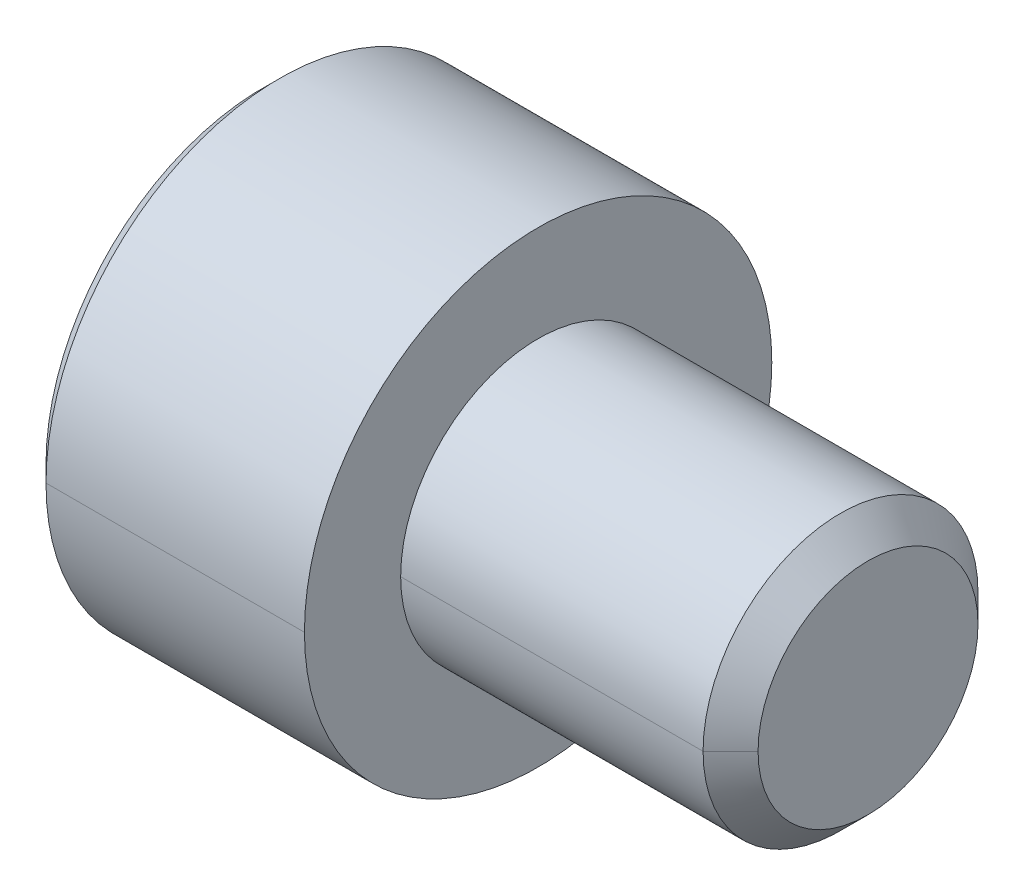
ISO-10303-21;
HEADER;
FILE_DESCRIPTION(('STEP AP214'),'2;1');
FILE_NAME('part.step','',(''),(''),'','','');
FILE_SCHEMA(('AUTOMOTIVE_DESIGN { 1 0 10303 214 1 1 1 1 }'));
ENDSEC;
DATA;
#1=APPLICATION_CONTEXT('core data for automotive mechanical design processes');
#2=APPLICATION_PROTOCOL_DEFINITION('international standard','automotive_design',2000,#1);
#3=PRODUCT_CONTEXT('',#1,'mechanical');
#4=PRODUCT('Part','Part','',(#3));
#5=PRODUCT_RELATED_PRODUCT_CATEGORY('part','',(#4));
#6=PRODUCT_DEFINITION_FORMATION('','',#4);
#7=PRODUCT_DEFINITION_CONTEXT('part definition',#1,'design');
#8=PRODUCT_DEFINITION('design','',#6,#7);
#9=PRODUCT_DEFINITION_SHAPE('','',#8);
#10=(LENGTH_UNIT() NAMED_UNIT(*) SI_UNIT(.MILLI.,.METRE.));
#11=(NAMED_UNIT(*) PLANE_ANGLE_UNIT() SI_UNIT($,.RADIAN.));
#12=(NAMED_UNIT(*) SI_UNIT($,.STERADIAN.) SOLID_ANGLE_UNIT());
#13=UNCERTAINTY_MEASURE_WITH_UNIT(LENGTH_MEASURE(1.E-05),#10,'distance_accuracy_value','');
#14=(GEOMETRIC_REPRESENTATION_CONTEXT(3) GLOBAL_UNCERTAINTY_ASSIGNED_CONTEXT((#13)) GLOBAL_UNIT_ASSIGNED_CONTEXT((#10,
#11,#12)) REPRESENTATION_CONTEXT('',''));
#15=CARTESIAN_POINT('',(0.,0.,0.));
#16=DIRECTION('',(0.,0.,1.));
#17=DIRECTION('',(1.,0.,0.));
#18=AXIS2_PLACEMENT_3D('',#15,#16,#17);
#19=CARTESIAN_POINT('',(-6.,2.59807621135332,1.5));
#20=DIRECTION('',(0.894427190999916,-0.387298334620742,-0.223606797749979));
#21=DIRECTION('',(0.,0.5,-0.866025403784439));
#22=AXIS2_PLACEMENT_3D('',#19,#20,#21);
#23=PLANE('',#22);
#24=DIRECTION('',(0.397359707119513,0.458831467741124,0.794719414239026));
#25=VECTOR('',#24,1.);
#26=CARTESIAN_POINT('',(-8.5,-1.15470053837925,-2.));
#27=LINE('',#26,#25);
#28=CARTESIAN_POINT('',(-8.5,-1.15470053837925,-2.));
#29=VERTEX_POINT('',#28);
#30=CARTESIAN_POINT('',(-7.5,0.,0.));
#31=VERTEX_POINT('',#30);
#32=EDGE_CURVE('E278',#29,#31,#27,.T.);
#33=ORIENTED_EDGE('',*,*,#32,.F.);
#34=CARTESIAN_POINT('',(-8.5,-1.15470053837925,-2.));
#35=CARTESIAN_POINT('',(-8.5,-1.53960071783901,-1.33333333333333));
#36=CARTESIAN_POINT('',(-8.5,-1.92450089729875,-0.666666666666667));
#37=CARTESIAN_POINT('',(-8.5,-2.30940107675851,0.));
#38=(BOUNDED_CURVE() B_SPLINE_CURVE(3,(#34,#35,#36,#37),.UNSPECIFIED.,.F.,
.F.) B_SPLINE_CURVE_WITH_KNOTS((4,4),(0.,1.),
.UNSPECIFIED.) CURVE() GEOMETRIC_REPRESENTATION_ITEM() RATIONAL_B_SPLINE_CURVE((1.,1.,1.,1.)) REPRESENTATION_ITEM(''));
#39=CARTESIAN_POINT('',(-8.5,-2.30940107675851,0.));
#40=VERTEX_POINT('',#39);
#41=EDGE_CURVE('E241',#29,#40,#38,.T.);
#42=ORIENTED_EDGE('',*,*,#41,.T.);
#43=DIRECTION('',(0.397359707119513,0.917662935482247,0.));
#44=VECTOR('',#43,1.);
#45=CARTESIAN_POINT('',(-8.5,-2.30940107675851,0.));
#46=LINE('',#45,#44);
#47=EDGE_CURVE('E10',#40,#31,#46,.T.);
#48=ORIENTED_EDGE('',*,*,#47,.T.);
#49=EDGE_LOOP('',(#33,#42,#48));
#50=FACE_BOUND('',#49,.T.);
#51=ADVANCED_FACE('F16',(#50),#23,.F.);
#52=CARTESIAN_POINT('',(-6.,2.59807621135332,-1.5));
#53=DIRECTION('',(0.894427190999916,-0.387298334620742,0.223606797749978));
#54=DIRECTION('',(0.,-0.5,-0.866025403784439));
#55=AXIS2_PLACEMENT_3D('',#52,#53,#54);
#56=PLANE('',#55);
#57=ORIENTED_EDGE('',*,*,#47,.F.);
#58=CARTESIAN_POINT('',(-8.5,-2.30940107675851,0.));
#59=CARTESIAN_POINT('',(-8.5,-1.92450089729875,0.666666666666667));
#60=CARTESIAN_POINT('',(-8.5,-1.53960071783901,1.33333333333333));
#61=CARTESIAN_POINT('',(-8.5,-1.15470053837925,2.));
#62=(BOUNDED_CURVE() B_SPLINE_CURVE(3,(#58,#59,#60,#61),.UNSPECIFIED.,.F.,
.F.) B_SPLINE_CURVE_WITH_KNOTS((4,4),(0.,1.),
.UNSPECIFIED.) CURVE() GEOMETRIC_REPRESENTATION_ITEM() RATIONAL_B_SPLINE_CURVE((1.,1.,1.,1.)) REPRESENTATION_ITEM(''));
#63=CARTESIAN_POINT('',(-8.5,-1.15470053837925,2.));
#64=VERTEX_POINT('',#63);
#65=EDGE_CURVE('E232',#40,#64,#62,.T.);
#66=ORIENTED_EDGE('',*,*,#65,.T.);
#67=DIRECTION('',(0.397359707119513,0.458831467741124,-0.794719414239026));
#68=VECTOR('',#67,1.);
#69=CARTESIAN_POINT('',(-8.5,-1.15470053837925,2.));
#70=LINE('',#69,#68);
#71=EDGE_CURVE('E27',#64,#31,#70,.T.);
#72=ORIENTED_EDGE('',*,*,#71,.T.);
#73=EDGE_LOOP('',(#57,#66,#72));
#74=FACE_BOUND('',#73,.T.);
#75=ADVANCED_FACE('F365',(#74),#56,.F.);
#76=CARTESIAN_POINT('',(-6.,0.,-3.));
#77=DIRECTION('',(0.894427190999916,0.,0.447213595499958));
#78=DIRECTION('',(0.,-1.,0.));
#79=AXIS2_PLACEMENT_3D('',#76,#77,#78);
#80=PLANE('',#79);
#81=ORIENTED_EDGE('',*,*,#71,.F.);
#82=CARTESIAN_POINT('',(-8.5,-1.15470053837925,2.));
#83=CARTESIAN_POINT('',(-8.5,-0.384900179459752,2.));
#84=CARTESIAN_POINT('',(-8.5,0.38490017945975,2.));
#85=CARTESIAN_POINT('',(-8.5,1.15470053837925,2.));
#86=(BOUNDED_CURVE() B_SPLINE_CURVE(3,(#82,#83,#84,#85),.UNSPECIFIED.,.F.,
.F.) B_SPLINE_CURVE_WITH_KNOTS((4,4),(0.,1.),
.UNSPECIFIED.) CURVE() GEOMETRIC_REPRESENTATION_ITEM() RATIONAL_B_SPLINE_CURVE((1.,1.,1.,1.)) REPRESENTATION_ITEM(''));
#87=CARTESIAN_POINT('',(-8.5,1.15470053837925,2.));
#88=VERTEX_POINT('',#87);
#89=EDGE_CURVE('E216',#64,#88,#86,.T.);
#90=ORIENTED_EDGE('',*,*,#89,.T.);
#91=DIRECTION('',(0.397359707119513,-0.458831467741124,-0.794719414239026));
#92=VECTOR('',#91,1.);
#93=CARTESIAN_POINT('',(-8.5,1.15470053837925,2.));
#94=LINE('',#93,#92);
#95=EDGE_CURVE('E282',#88,#31,#94,.T.);
#96=ORIENTED_EDGE('',*,*,#95,.T.);
#97=EDGE_LOOP('',(#81,#90,#96));
#98=FACE_BOUND('',#97,.T.);
#99=ADVANCED_FACE('F366',(#98),#80,.F.);
#100=CARTESIAN_POINT('',(-6.,-2.59807621135332,-1.5));
#101=DIRECTION('',(0.894427190999916,0.387298334620742,0.223606797749979));
#102=DIRECTION('',(0.,0.5,-0.866025403784439));
#103=AXIS2_PLACEMENT_3D('',#100,#101,#102);
#104=PLANE('',#103);
#105=ORIENTED_EDGE('',*,*,#95,.F.);
#106=CARTESIAN_POINT('',(-8.5,1.15470053837925,2.));
#107=CARTESIAN_POINT('',(-8.5,1.539600717839,1.33333333333333));
#108=CARTESIAN_POINT('',(-8.5,1.92450089729875,0.666666666666667));
#109=CARTESIAN_POINT('',(-8.5,2.30940107675851,0.));
#110=(BOUNDED_CURVE() B_SPLINE_CURVE(3,(#106,#107,#108,#109),.UNSPECIFIED.,.F.,
.F.) B_SPLINE_CURVE_WITH_KNOTS((4,4),(0.,1.),
.UNSPECIFIED.) CURVE() GEOMETRIC_REPRESENTATION_ITEM() RATIONAL_B_SPLINE_CURVE((1.,1.,1.,1.)) REPRESENTATION_ITEM(''));
#111=CARTESIAN_POINT('',(-8.5,2.30940107675851,0.));
#112=VERTEX_POINT('',#111);
#113=EDGE_CURVE('E217',#88,#112,#110,.T.);
#114=ORIENTED_EDGE('',*,*,#113,.T.);
#115=DIRECTION('',(0.397359707119513,-0.917662935482247,0.));
#116=VECTOR('',#115,1.);
#117=CARTESIAN_POINT('',(-8.5,2.30940107675851,0.));
#118=LINE('',#117,#116);
#119=EDGE_CURVE('E218',#112,#31,#118,.T.);
#120=ORIENTED_EDGE('',*,*,#119,.T.);
#121=EDGE_LOOP('',(#105,#114,#120));
#122=FACE_BOUND('',#121,.T.);
#123=ADVANCED_FACE('F378',(#122),#104,.F.);
#124=CARTESIAN_POINT('',(-6.,0.,3.));
#125=DIRECTION('',(0.894427190999916,0.,-0.447213595499958));
#126=DIRECTION('',(0.,-1.,0.));
#127=AXIS2_PLACEMENT_3D('',#124,#125,#126);
#128=PLANE('',#127);
#129=DIRECTION('',(0.397359707119513,-0.458831467741124,0.794719414239026));
#130=VECTOR('',#129,1.);
#131=CARTESIAN_POINT('',(-8.5,1.15470053837925,-2.));
#132=LINE('',#131,#130);
#133=CARTESIAN_POINT('',(-8.5,1.15470053837925,-2.));
#134=VERTEX_POINT('',#133);
#135=EDGE_CURVE('E221',#134,#31,#132,.T.);
#136=ORIENTED_EDGE('',*,*,#135,.F.);
#137=CARTESIAN_POINT('',(-8.5,1.15470053837925,-2.));
#138=CARTESIAN_POINT('',(-8.5,0.384900179459751,-2.));
#139=CARTESIAN_POINT('',(-8.5,-0.384900179459751,-2.));
#140=CARTESIAN_POINT('',(-8.5,-1.15470053837925,-2.));
#141=(BOUNDED_CURVE() B_SPLINE_CURVE(3,(#137,#138,#139,#140),.UNSPECIFIED.,.F.,
.F.) B_SPLINE_CURVE_WITH_KNOTS((4,4),(0.,1.),
.UNSPECIFIED.) CURVE() GEOMETRIC_REPRESENTATION_ITEM() RATIONAL_B_SPLINE_CURVE((1.,1.,1.,1.)) REPRESENTATION_ITEM(''));
#142=EDGE_CURVE('E321',#134,#29,#141,.T.);
#143=ORIENTED_EDGE('',*,*,#142,.T.);
#144=ORIENTED_EDGE('',*,*,#32,.T.);
#145=EDGE_LOOP('',(#136,#143,#144));
#146=FACE_BOUND('',#145,.T.);
#147=ADVANCED_FACE('F18',(#146),#128,.F.);
#148=CARTESIAN_POINT('',(-6.,-2.59807621135332,1.5));
#149=DIRECTION('',(0.894427190999916,0.387298334620742,-0.223606797749979));
#150=DIRECTION('',(0.,-0.5,-0.866025403784439));
#151=AXIS2_PLACEMENT_3D('',#148,#149,#150);
#152=PLANE('',#151);
#153=ORIENTED_EDGE('',*,*,#119,.F.);
#154=CARTESIAN_POINT('',(-8.5,2.30940107675851,0.));
#155=CARTESIAN_POINT('',(-8.5,1.92450089729875,-0.666666666666667));
#156=CARTESIAN_POINT('',(-8.5,1.53960071783901,-1.33333333333333));
#157=CARTESIAN_POINT('',(-8.5,1.15470053837925,-2.));
#158=(BOUNDED_CURVE() B_SPLINE_CURVE(3,(#154,#155,#156,#157),.UNSPECIFIED.,.F.,
.F.) B_SPLINE_CURVE_WITH_KNOTS((4,4),(0.,1.),
.UNSPECIFIED.) CURVE() GEOMETRIC_REPRESENTATION_ITEM() RATIONAL_B_SPLINE_CURVE((1.,1.,1.,1.)) REPRESENTATION_ITEM(''));
#159=EDGE_CURVE('E222',#112,#134,#158,.T.);
#160=ORIENTED_EDGE('',*,*,#159,.T.);
#161=ORIENTED_EDGE('',*,*,#135,.T.);
#162=EDGE_LOOP('',(#153,#160,#161));
#163=FACE_BOUND('',#162,.T.);
#164=ADVANCED_FACE('F382',(#163),#152,.F.);
#165=CARTESIAN_POINT('',(-11.,0.,0.));
#166=DIRECTION('',(1.,0.,0.));
#167=DIRECTION('',(0.,0.,-1.));
#168=AXIS2_PLACEMENT_3D('',#165,#166,#167);
#169=CONICAL_SURFACE('',#168,3.95,0.785398163397446);
#170=DIRECTION('',(0.70710678118655,0.,0.707106781186546));
#171=VECTOR('',#170,1.);
#172=CARTESIAN_POINT('',(-11.,0.,3.95));
#173=LINE('',#172,#171);
#174=CARTESIAN_POINT('',(-11.,0.,3.95));
#175=VERTEX_POINT('',#174);
#176=CARTESIAN_POINT('',(-10.7,0.,4.25));
#177=VERTEX_POINT('',#176);
#178=EDGE_CURVE('E194',#175,#177,#173,.T.);
#179=ORIENTED_EDGE('',*,*,#178,.F.);
#180=CARTESIAN_POINT('',(-11.,0.,0.));
#181=DIRECTION('',(-1.,0.,0.));
#182=DIRECTION('',(0.,0.,-1.));
#183=AXIS2_PLACEMENT_3D('',#180,#181,#182);
#184=CIRCLE('',#183,3.95);
#185=CARTESIAN_POINT('',(-11.,0.,-3.95));
#186=VERTEX_POINT('',#185);
#187=EDGE_CURVE('E307',#186,#175,#184,.T.);
#188=ORIENTED_EDGE('',*,*,#187,.F.);
#189=DIRECTION('',(0.70710678118655,0.,-0.707106781186546));
#190=VECTOR('',#189,1.);
#191=CARTESIAN_POINT('',(-11.,0.,-3.95));
#192=LINE('',#191,#190);
#193=CARTESIAN_POINT('',(-10.7,0.,-4.25));
#194=VERTEX_POINT('',#193);
#195=EDGE_CURVE('E189',#186,#194,#192,.T.);
#196=ORIENTED_EDGE('',*,*,#195,.T.);
#197=CARTESIAN_POINT('',(-10.7,0.,0.));
#198=DIRECTION('',(1.,0.,0.));
#199=DIRECTION('',(0.,0.,-1.));
#200=AXIS2_PLACEMENT_3D('',#197,#198,#199);
#201=CIRCLE('',#200,4.25);
#202=EDGE_CURVE('E239',#177,#194,#201,.T.);
#203=ORIENTED_EDGE('',*,*,#202,.F.);
#204=EDGE_LOOP('',(#179,#188,#196,#203));
#205=FACE_BOUND('',#204,.T.);
#206=ADVANCED_FACE('F414',(#205),#169,.T.);
#207=CARTESIAN_POINT('',(-8.5,2.30940107675851,0.));
#208=DIRECTION('',(0.,0.866025403784439,-0.5));
#209=DIRECTION('',(-1.,0.,0.));
#210=AXIS2_PLACEMENT_3D('',#207,#208,#209);
#211=PLANE('',#210);
#212=DIRECTION('',(0.,-0.5,-0.866025403784439));
#213=VECTOR('',#212,1.);
#214=CARTESIAN_POINT('',(-11.,2.30940107675851,0.));
#215=LINE('',#214,#213);
#216=CARTESIAN_POINT('',(-11.,2.30940107675851,0.));
#217=VERTEX_POINT('',#216);
#218=CARTESIAN_POINT('',(-11.,1.15470053837925,-2.));
#219=VERTEX_POINT('',#218);
#220=EDGE_CURVE('E228',#217,#219,#215,.T.);
#221=ORIENTED_EDGE('',*,*,#220,.T.);
#222=DIRECTION('',(-1.,0.,0.));
#223=VECTOR('',#222,1.);
#224=CARTESIAN_POINT('',(-8.5,1.15470053837925,-2.));
#225=LINE('',#224,#223);
#226=EDGE_CURVE('E267',#134,#219,#225,.T.);
#227=ORIENTED_EDGE('',*,*,#226,.F.);
#228=ORIENTED_EDGE('',*,*,#159,.F.);
#229=DIRECTION('',(-1.,0.,0.));
#230=VECTOR('',#229,1.);
#231=CARTESIAN_POINT('',(-8.5,2.30940107675851,0.));
#232=LINE('',#231,#230);
#233=EDGE_CURVE('E288',#112,#217,#232,.T.);
#234=ORIENTED_EDGE('',*,*,#233,.T.);
#235=EDGE_LOOP('',(#221,#227,#228,#234));
#236=FACE_BOUND('',#235,.T.);
#237=ADVANCED_FACE('F384',(#236),#211,.F.);
#238=CARTESIAN_POINT('',(-8.5,1.15470053837925,-2.));
#239=DIRECTION('',(0.,0.,-1.));
#240=DIRECTION('',(0.,-1.,0.));
#241=AXIS2_PLACEMENT_3D('',#238,#239,#240);
#242=PLANE('',#241);
#243=DIRECTION('',(0.,-1.,0.));
#244=VECTOR('',#243,1.);
#245=CARTESIAN_POINT('',(-11.,1.15470053837925,-2.));
#246=LINE('',#245,#244);
#247=CARTESIAN_POINT('',(-11.,-1.15470053837925,-2.));
#248=VERTEX_POINT('',#247);
#249=EDGE_CURVE('E291',#219,#248,#246,.T.);
#250=ORIENTED_EDGE('',*,*,#249,.T.);
#251=DIRECTION('',(-1.,0.,0.));
#252=VECTOR('',#251,1.);
#253=CARTESIAN_POINT('',(-8.5,-1.15470053837925,-2.));
#254=LINE('',#253,#252);
#255=EDGE_CURVE('E111',#29,#248,#254,.T.);
#256=ORIENTED_EDGE('',*,*,#255,.F.);
#257=ORIENTED_EDGE('',*,*,#142,.F.);
#258=ORIENTED_EDGE('',*,*,#226,.T.);
#259=EDGE_LOOP('',(#250,#256,#257,#258));
#260=FACE_BOUND('',#259,.T.);
#261=ADVANCED_FACE('F386',(#260),#242,.F.);
#262=CARTESIAN_POINT('',(-8.5,-1.15470053837925,-2.));
#263=DIRECTION('',(0.,-0.866025403784439,-0.5));
#264=DIRECTION('',(0.,0.5,-0.866025403784439));
#265=AXIS2_PLACEMENT_3D('',#262,#263,#264);
#266=PLANE('',#265);
#267=DIRECTION('',(0.,-0.5,0.866025403784439));
#268=VECTOR('',#267,1.);
#269=CARTESIAN_POINT('',(-11.,-1.15470053837925,-2.));
#270=LINE('',#269,#268);
#271=CARTESIAN_POINT('',(-11.,-2.30940107675851,0.));
#272=VERTEX_POINT('',#271);
#273=EDGE_CURVE('E207',#248,#272,#270,.T.);
#274=ORIENTED_EDGE('',*,*,#273,.T.);
#275=DIRECTION('',(-1.,0.,0.));
#276=VECTOR('',#275,1.);
#277=CARTESIAN_POINT('',(-8.5,-2.30940107675851,0.));
#278=LINE('',#277,#276);
#279=EDGE_CURVE('E99',#40,#272,#278,.T.);
#280=ORIENTED_EDGE('',*,*,#279,.F.);
#281=ORIENTED_EDGE('',*,*,#41,.F.);
#282=ORIENTED_EDGE('',*,*,#255,.T.);
#283=EDGE_LOOP('',(#274,#280,#281,#282));
#284=FACE_BOUND('',#283,.T.);
#285=ADVANCED_FACE('F387',(#284),#266,.F.);
#286=CARTESIAN_POINT('',(-8.5,-2.30940107675851,0.));
#287=DIRECTION('',(0.,-0.866025403784439,0.5));
#288=DIRECTION('',(-1.,0.,0.));
#289=AXIS2_PLACEMENT_3D('',#286,#287,#288);
#290=PLANE('',#289);
#291=DIRECTION('',(0.,0.5,0.866025403784439));
#292=VECTOR('',#291,1.);
#293=CARTESIAN_POINT('',(-11.,-2.30940107675851,0.));
#294=LINE('',#293,#292);
#295=CARTESIAN_POINT('',(-11.,-1.15470053837925,2.));
#296=VERTEX_POINT('',#295);
#297=EDGE_CURVE('E204',#272,#296,#294,.T.);
#298=ORIENTED_EDGE('',*,*,#297,.T.);
#299=DIRECTION('',(-1.,0.,0.));
#300=VECTOR('',#299,1.);
#301=CARTESIAN_POINT('',(-8.5,-1.15470053837925,2.));
#302=LINE('',#301,#300);
#303=EDGE_CURVE('E229',#64,#296,#302,.T.);
#304=ORIENTED_EDGE('',*,*,#303,.F.);
#305=ORIENTED_EDGE('',*,*,#65,.F.);
#306=ORIENTED_EDGE('',*,*,#279,.T.);
#307=EDGE_LOOP('',(#298,#304,#305,#306));
#308=FACE_BOUND('',#307,.T.);
#309=ADVANCED_FACE('F444',(#308),#290,.F.);
#310=CARTESIAN_POINT('',(-8.5,-1.15470053837925,2.));
#311=DIRECTION('',(0.,0.,1.));
#312=DIRECTION('',(0.,-1.,0.));
#313=AXIS2_PLACEMENT_3D('',#310,#311,#312);
#314=PLANE('',#313);
#315=DIRECTION('',(0.,1.,0.));
#316=VECTOR('',#315,1.);
#317=CARTESIAN_POINT('',(-11.,-1.15470053837925,2.));
#318=LINE('',#317,#316);
#319=CARTESIAN_POINT('',(-11.,1.15470053837925,2.));
#320=VERTEX_POINT('',#319);
#321=EDGE_CURVE('E208',#296,#320,#318,.T.);
#322=ORIENTED_EDGE('',*,*,#321,.T.);
#323=DIRECTION('',(-1.,0.,0.));
#324=VECTOR('',#323,1.);
#325=CARTESIAN_POINT('',(-8.5,1.15470053837925,2.));
#326=LINE('',#325,#324);
#327=EDGE_CURVE('E212',#88,#320,#326,.T.);
#328=ORIENTED_EDGE('',*,*,#327,.F.);
#329=ORIENTED_EDGE('',*,*,#89,.F.);
#330=ORIENTED_EDGE('',*,*,#303,.T.);
#331=EDGE_LOOP('',(#322,#328,#329,#330));
#332=FACE_BOUND('',#331,.T.);
#333=ADVANCED_FACE('F371',(#332),#314,.F.);
#334=CARTESIAN_POINT('',(-8.5,1.15470053837925,2.));
#335=DIRECTION('',(0.,0.866025403784439,0.5));
#336=DIRECTION('',(1.,0.,0.));
#337=AXIS2_PLACEMENT_3D('',#334,#335,#336);
#338=PLANE('',#337);
#339=DIRECTION('',(0.,0.5,-0.866025403784439));
#340=VECTOR('',#339,1.);
#341=CARTESIAN_POINT('',(-11.,1.15470053837925,2.));
#342=LINE('',#341,#340);
#343=EDGE_CURVE('E224',#320,#217,#342,.T.);
#344=ORIENTED_EDGE('',*,*,#343,.T.);
#345=ORIENTED_EDGE('',*,*,#233,.F.);
#346=ORIENTED_EDGE('',*,*,#113,.F.);
#347=ORIENTED_EDGE('',*,*,#327,.T.);
#348=EDGE_LOOP('',(#344,#345,#346,#347));
#349=FACE_BOUND('',#348,.T.);
#350=ADVANCED_FACE('F376',(#349),#338,.F.);
#351=CARTESIAN_POINT('',(-0.5,0.,0.));
#352=DIRECTION('',(-1.,0.,0.));
#353=DIRECTION('',(0.,0.,1.));
#354=AXIS2_PLACEMENT_3D('',#351,#352,#353);
#355=CONICAL_SURFACE('',#354,2.5,0.78539816339745);
#356=DIRECTION('',(-0.707106781186546,0.,-0.707106781186549));
#357=VECTOR('',#356,1.);
#358=CARTESIAN_POINT('',(-0.5,0.,-2.5));
#359=LINE('',#358,#357);
#360=CARTESIAN_POINT('',(0.,0.,-2.));
#361=VERTEX_POINT('',#360);
#362=CARTESIAN_POINT('',(-0.5,0.,-2.5));
#363=VERTEX_POINT('',#362);
#364=EDGE_CURVE('E152',#361,#363,#359,.T.);
#365=ORIENTED_EDGE('',*,*,#364,.F.);
#366=CARTESIAN_POINT('',(0.,0.,0.));
#367=DIRECTION('',(1.,0.,0.));
#368=DIRECTION('',(0.,0.,1.));
#369=AXIS2_PLACEMENT_3D('',#366,#367,#368);
#370=CIRCLE('',#369,2.);
#371=CARTESIAN_POINT('',(0.,0.,2.));
#372=VERTEX_POINT('',#371);
#373=EDGE_CURVE('E142',#372,#361,#370,.T.);
#374=ORIENTED_EDGE('',*,*,#373,.F.);
#375=DIRECTION('',(-0.707106781186546,0.,0.707106781186549));
#376=VECTOR('',#375,1.);
#377=CARTESIAN_POINT('',(-0.5,0.,2.5));
#378=LINE('',#377,#376);
#379=CARTESIAN_POINT('',(-0.5,0.,2.5));
#380=VERTEX_POINT('',#379);
#381=EDGE_CURVE('E154',#372,#380,#378,.T.);
#382=ORIENTED_EDGE('',*,*,#381,.T.);
#383=CARTESIAN_POINT('',(-0.5,0.,0.));
#384=DIRECTION('',(-1.,0.,0.));
#385=DIRECTION('',(0.,0.,1.));
#386=AXIS2_PLACEMENT_3D('',#383,#384,#385);
#387=CIRCLE('',#386,2.5);
#388=EDGE_CURVE('E148',#363,#380,#387,.T.);
#389=ORIENTED_EDGE('',*,*,#388,.F.);
#390=EDGE_LOOP('',(#365,#374,#382,#389));
#391=FACE_BOUND('',#390,.T.);
#392=ADVANCED_FACE('F150',(#391),#355,.T.);
#393=CARTESIAN_POINT('',(-11.,4.25,0.));
#394=DIRECTION('',(1.,0.,0.));
#395=DIRECTION('',(0.,1.,0.));
#396=AXIS2_PLACEMENT_3D('',#393,#394,#395);
#397=PLANE('',#396);
#398=ORIENTED_EDGE('',*,*,#220,.F.);
#399=ORIENTED_EDGE('',*,*,#343,.F.);
#400=ORIENTED_EDGE('',*,*,#321,.F.);
#401=ORIENTED_EDGE('',*,*,#297,.F.);
#402=ORIENTED_EDGE('',*,*,#273,.F.);
#403=ORIENTED_EDGE('',*,*,#249,.F.);
#404=EDGE_LOOP('',(#398,#399,#400,#401,#402,#403));
#405=FACE_BOUND('',#404,.T.);
#406=ORIENTED_EDGE('',*,*,#187,.T.);
#407=CARTESIAN_POINT('',(-11.,0.,0.));
#408=DIRECTION('',(-1.,0.,0.));
#409=DIRECTION('',(0.,0.,-1.));
#410=AXIS2_PLACEMENT_3D('',#407,#408,#409);
#411=CIRCLE('',#410,3.95);
#412=EDGE_CURVE('E197',#175,#186,#411,.T.);
#413=ORIENTED_EDGE('',*,*,#412,.T.);
#414=EDGE_LOOP('',(#406,#413));
#415=FACE_BOUND('',#414,.T.);
#416=ADVANCED_FACE('F429',(#405,#415),#397,.F.);
#417=CARTESIAN_POINT('',(0.,0.,0.));
#418=DIRECTION('',(-1.,0.,0.));
#419=DIRECTION('',(0.,0.,1.));
#420=AXIS2_PLACEMENT_3D('',#417,#418,#419);
#421=CYLINDRICAL_SURFACE('',#420,4.25);
#422=DIRECTION('',(-1.,0.,0.));
#423=VECTOR('',#422,1.);
#424=CARTESIAN_POINT('',(0.,0.,-4.25));
#425=LINE('',#424,#423);
#426=CARTESIAN_POINT('',(-6.,0.,-4.25));
#427=VERTEX_POINT('',#426);
#428=EDGE_CURVE('E233',#427,#194,#425,.T.);
#429=ORIENTED_EDGE('',*,*,#428,.F.);
#430=CARTESIAN_POINT('',(-6.,0.,0.));
#431=DIRECTION('',(-1.,0.,0.));
#432=DIRECTION('',(0.,0.,1.));
#433=AXIS2_PLACEMENT_3D('',#430,#431,#432);
#434=CIRCLE('',#433,4.25);
#435=CARTESIAN_POINT('',(-6.,0.,4.25));
#436=VERTEX_POINT('',#435);
#437=EDGE_CURVE('E237',#427,#436,#434,.T.);
#438=ORIENTED_EDGE('',*,*,#437,.T.);
#439=DIRECTION('',(-1.,0.,0.));
#440=VECTOR('',#439,1.);
#441=CARTESIAN_POINT('',(0.,0.,4.25));
#442=LINE('',#441,#440);
#443=EDGE_CURVE('E171',#436,#177,#442,.T.);
#444=ORIENTED_EDGE('',*,*,#443,.T.);
#445=ORIENTED_EDGE('',*,*,#202,.T.);
#446=EDGE_LOOP('',(#429,#438,#444,#445));
#447=FACE_BOUND('',#446,.T.);
#448=ADVANCED_FACE('F416',(#447),#421,.T.);
#449=CARTESIAN_POINT('',(-6.,2.5,0.));
#450=DIRECTION('',(-1.,0.,0.));
#451=DIRECTION('',(0.,0.,1.));
#452=AXIS2_PLACEMENT_3D('',#449,#450,#451);
#453=PLANE('',#452);
#454=CARTESIAN_POINT('',(-6.,0.,0.));
#455=DIRECTION('',(-1.,0.,0.));
#456=DIRECTION('',(0.,0.,1.));
#457=AXIS2_PLACEMENT_3D('',#454,#455,#456);
#458=CIRCLE('',#457,2.5);
#459=CARTESIAN_POINT('',(-6.,0.,2.5));
#460=VERTEX_POINT('',#459);
#461=CARTESIAN_POINT('',(-6.,0.,-2.5));
#462=VERTEX_POINT('',#461);
#463=EDGE_CURVE('E170',#460,#462,#458,.T.);
#464=ORIENTED_EDGE('',*,*,#463,.T.);
#465=CARTESIAN_POINT('',(-6.,0.,0.));
#466=DIRECTION('',(-1.,0.,0.));
#467=DIRECTION('',(0.,0.,1.));
#468=AXIS2_PLACEMENT_3D('',#465,#466,#467);
#469=CIRCLE('',#468,2.5);
#470=EDGE_CURVE('E20',#462,#460,#469,.T.);
#471=ORIENTED_EDGE('',*,*,#470,.T.);
#472=EDGE_LOOP('',(#464,#471));
#473=FACE_BOUND('',#472,.T.);
#474=CARTESIAN_POINT('',(-6.,0.,0.));
#475=DIRECTION('',(-1.,0.,0.));
#476=DIRECTION('',(0.,0.,1.));
#477=AXIS2_PLACEMENT_3D('',#474,#475,#476);
#478=CIRCLE('',#477,4.25);
#479=EDGE_CURVE('E201',#436,#427,#478,.T.);
#480=ORIENTED_EDGE('',*,*,#479,.F.);
#481=ORIENTED_EDGE('',*,*,#437,.F.);
#482=EDGE_LOOP('',(#480,#481));
#483=FACE_BOUND('',#482,.T.);
#484=ADVANCED_FACE('F418',(#473,#483),#453,.F.);
#485=CARTESIAN_POINT('',(0.,0.,0.));
#486=DIRECTION('',(-1.,0.,0.));
#487=DIRECTION('',(0.,0.,1.));
#488=AXIS2_PLACEMENT_3D('',#485,#486,#487);
#489=CYLINDRICAL_SURFACE('',#488,2.5);
#490=DIRECTION('',(-1.,0.,0.));
#491=VECTOR('',#490,1.);
#492=CARTESIAN_POINT('',(0.,0.,-2.5));
#493=LINE('',#492,#491);
#494=EDGE_CURVE('E162',#363,#462,#493,.T.);
#495=ORIENTED_EDGE('',*,*,#494,.F.);
#496=ORIENTED_EDGE('',*,*,#388,.T.);
#497=DIRECTION('',(-1.,0.,0.));
#498=VECTOR('',#497,1.);
#499=CARTESIAN_POINT('',(0.,0.,2.5));
#500=LINE('',#499,#498);
#501=EDGE_CURVE('E175',#380,#460,#500,.T.);
#502=ORIENTED_EDGE('',*,*,#501,.T.);
#503=ORIENTED_EDGE('',*,*,#470,.F.);
#504=EDGE_LOOP('',(#495,#496,#502,#503));
#505=FACE_BOUND('',#504,.T.);
#506=ADVANCED_FACE('F164',(#505),#489,.T.);
#507=CARTESIAN_POINT('',(0.,0.,0.));
#508=DIRECTION('',(-1.,0.,0.));
#509=DIRECTION('',(0.,0.,1.));
#510=AXIS2_PLACEMENT_3D('',#507,#508,#509);
#511=PLANE('',#510);
#512=ORIENTED_EDGE('',*,*,#373,.T.);
#513=CARTESIAN_POINT('',(0.,0.,0.));
#514=DIRECTION('',(1.,0.,0.));
#515=DIRECTION('',(0.,0.,1.));
#516=AXIS2_PLACEMENT_3D('',#513,#514,#515);
#517=CIRCLE('',#516,2.);
#518=EDGE_CURVE('E181',#361,#372,#517,.T.);
#519=ORIENTED_EDGE('',*,*,#518,.T.);
#520=EDGE_LOOP('',(#512,#519));
#521=FACE_BOUND('',#520,.T.);
#522=ADVANCED_FACE('F427',(#521),#511,.F.);
#523=CARTESIAN_POINT('',(0.,0.,0.));
#524=DIRECTION('',(-1.,0.,0.));
#525=DIRECTION('',(0.,0.,1.));
#526=AXIS2_PLACEMENT_3D('',#523,#524,#525);
#527=CYLINDRICAL_SURFACE('',#526,2.5);
#528=CARTESIAN_POINT('',(-0.5,0.,0.));
#529=DIRECTION('',(-1.,0.,0.));
#530=DIRECTION('',(0.,0.,1.));
#531=AXIS2_PLACEMENT_3D('',#528,#529,#530);
#532=CIRCLE('',#531,2.5);
#533=EDGE_CURVE('E173',#380,#363,#532,.T.);
#534=ORIENTED_EDGE('',*,*,#533,.T.);
#535=ORIENTED_EDGE('',*,*,#494,.T.);
#536=ORIENTED_EDGE('',*,*,#463,.F.);
#537=ORIENTED_EDGE('',*,*,#501,.F.);
#538=EDGE_LOOP('',(#534,#535,#536,#537));
#539=FACE_BOUND('',#538,.T.);
#540=ADVANCED_FACE('F174',(#539),#527,.T.);
#541=CARTESIAN_POINT('',(0.,0.,0.));
#542=DIRECTION('',(-1.,0.,0.));
#543=DIRECTION('',(0.,0.,1.));
#544=AXIS2_PLACEMENT_3D('',#541,#542,#543);
#545=CYLINDRICAL_SURFACE('',#544,4.25);
#546=ORIENTED_EDGE('',*,*,#479,.T.);
#547=ORIENTED_EDGE('',*,*,#428,.T.);
#548=CARTESIAN_POINT('',(-10.7,0.,0.));
#549=DIRECTION('',(1.,0.,0.));
#550=DIRECTION('',(0.,0.,-1.));
#551=AXIS2_PLACEMENT_3D('',#548,#549,#550);
#552=CIRCLE('',#551,4.25);
#553=EDGE_CURVE('E196',#194,#177,#552,.T.);
#554=ORIENTED_EDGE('',*,*,#553,.T.);
#555=ORIENTED_EDGE('',*,*,#443,.F.);
#556=EDGE_LOOP('',(#546,#547,#554,#555));
#557=FACE_BOUND('',#556,.T.);
#558=ADVANCED_FACE('F404',(#557),#545,.T.);
#559=CARTESIAN_POINT('',(-0.5,0.,0.));
#560=DIRECTION('',(-1.,0.,0.));
#561=DIRECTION('',(0.,0.,1.));
#562=AXIS2_PLACEMENT_3D('',#559,#560,#561);
#563=CONICAL_SURFACE('',#562,2.5,0.78539816339745);
#564=ORIENTED_EDGE('',*,*,#518,.F.);
#565=ORIENTED_EDGE('',*,*,#364,.T.);
#566=ORIENTED_EDGE('',*,*,#533,.F.);
#567=ORIENTED_EDGE('',*,*,#381,.F.);
#568=EDGE_LOOP('',(#564,#565,#566,#567));
#569=FACE_BOUND('',#568,.T.);
#570=ADVANCED_FACE('F179',(#569),#563,.T.);
#571=CARTESIAN_POINT('',(-11.,0.,0.));
#572=DIRECTION('',(1.,0.,0.));
#573=DIRECTION('',(0.,0.,-1.));
#574=AXIS2_PLACEMENT_3D('',#571,#572,#573);
#575=CONICAL_SURFACE('',#574,3.95,0.785398163397446);
#576=ORIENTED_EDGE('',*,*,#412,.F.);
#577=ORIENTED_EDGE('',*,*,#178,.T.);
#578=ORIENTED_EDGE('',*,*,#553,.F.);
#579=ORIENTED_EDGE('',*,*,#195,.F.);
#580=EDGE_LOOP('',(#576,#577,#578,#579));
#581=FACE_BOUND('',#580,.T.);
#582=ADVANCED_FACE('F411',(#581),#575,.T.);
#583=CLOSED_SHELL('',(#51,#75,#99,#123,#147,#164,#206,#237,#261,#285,#309,#333,#350,#392,#416,
#448,#484,#506,#522,#540,#558,#570,#582));
#584=MANIFOLD_SOLID_BREP('B1',#583);
#585=ADVANCED_BREP_SHAPE_REPRESENTATION('',(#18,#584),#14);
#586=SHAPE_DEFINITION_REPRESENTATION(#9,#585);
ENDSEC;
END-ISO-10303-21;
